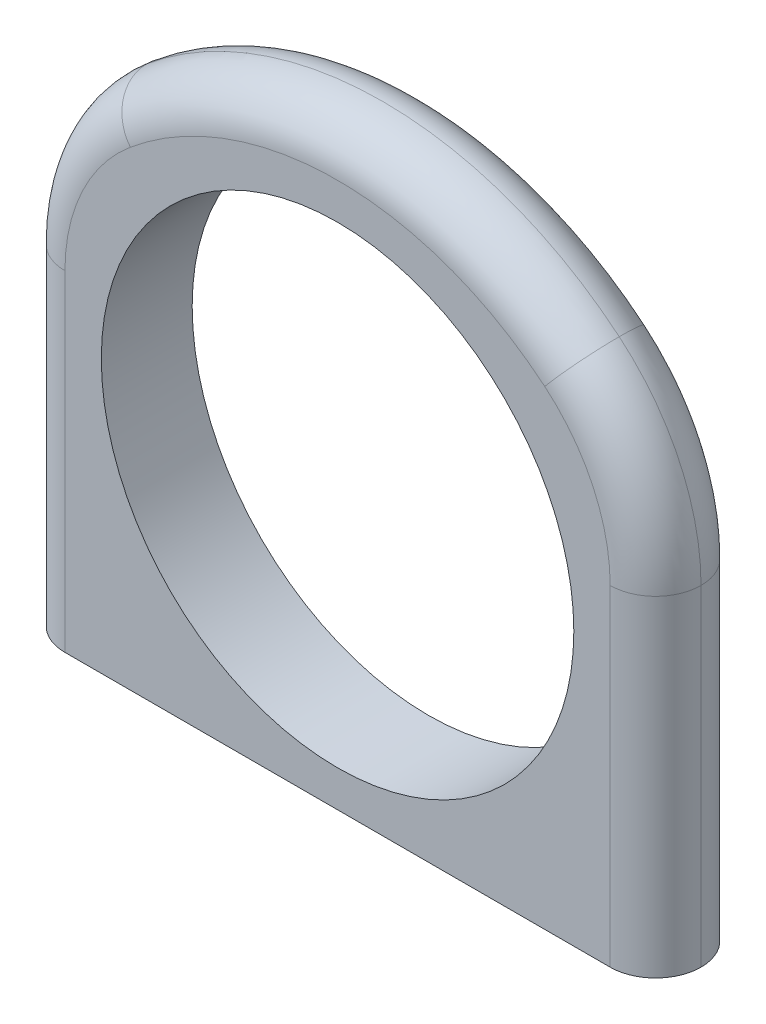
ISO-10303-21;
HEADER;
FILE_DESCRIPTION(('STEP AP214'),'2;1');
FILE_NAME('part.step','',(''),(''),'','','');
FILE_SCHEMA(('AUTOMOTIVE_DESIGN { 1 0 10303 214 1 1 1 1 }'));
ENDSEC;
DATA;
#1=APPLICATION_CONTEXT('core data for automotive mechanical design processes');
#2=APPLICATION_PROTOCOL_DEFINITION('international standard','automotive_design',2000,#1);
#3=PRODUCT_CONTEXT('',#1,'mechanical');
#4=PRODUCT('Part','Part','',(#3));
#5=PRODUCT_RELATED_PRODUCT_CATEGORY('part','',(#4));
#6=PRODUCT_DEFINITION_FORMATION('','',#4);
#7=PRODUCT_DEFINITION_CONTEXT('part definition',#1,'design');
#8=PRODUCT_DEFINITION('design','',#6,#7);
#9=PRODUCT_DEFINITION_SHAPE('','',#8);
#10=(LENGTH_UNIT() NAMED_UNIT(*) SI_UNIT(.MILLI.,.METRE.));
#11=(NAMED_UNIT(*) PLANE_ANGLE_UNIT() SI_UNIT($,.RADIAN.));
#12=(NAMED_UNIT(*) SI_UNIT($,.STERADIAN.) SOLID_ANGLE_UNIT());
#13=UNCERTAINTY_MEASURE_WITH_UNIT(LENGTH_MEASURE(1.E-05),#10,'distance_accuracy_value','');
#14=(GEOMETRIC_REPRESENTATION_CONTEXT(3) GLOBAL_UNCERTAINTY_ASSIGNED_CONTEXT((#13)) GLOBAL_UNIT_ASSIGNED_CONTEXT((#10,
#11,#12)) REPRESENTATION_CONTEXT('',''));
#15=CARTESIAN_POINT('',(0.,0.,0.));
#16=DIRECTION('',(0.,0.,1.));
#17=DIRECTION('',(1.,0.,0.));
#18=AXIS2_PLACEMENT_3D('',#15,#16,#17);
#19=CARTESIAN_POINT('',(0.,-30.,5.));
#20=DIRECTION('',(0.,1.,0.));
#21=DIRECTION('',(0.,0.,1.));
#22=AXIS2_PLACEMENT_3D('',#19,#20,#21);
#23=PLANE('',#22);
#24=CARTESIAN_POINT('',(-7.5,-30.,0.));
#25=DIRECTION('',(0.,-1.,0.));
#26=DIRECTION('',(0.,0.,-1.));
#27=AXIS2_PLACEMENT_3D('',#24,#25,#26);
#28=CIRCLE('',#27,2.);
#29=CARTESIAN_POINT('',(-7.5,-30.,-2.));
#30=VERTEX_POINT('',#29);
#31=EDGE_CURVE('E178',#30,#30,#28,.T.);
#32=ORIENTED_EDGE('',*,*,#31,.F.);
#33=EDGE_LOOP('',(#32));
#34=FACE_BOUND('',#33,.T.);
#35=CARTESIAN_POINT('',(7.5,-30.,0.));
#36=DIRECTION('',(0.,-1.,0.));
#37=DIRECTION('',(0.,0.,-1.));
#38=AXIS2_PLACEMENT_3D('',#35,#36,#37);
#39=CIRCLE('',#38,2.);
#40=CARTESIAN_POINT('',(7.5,-30.,-2.));
#41=VERTEX_POINT('',#40);
#42=EDGE_CURVE('E173',#41,#41,#39,.T.);
#43=ORIENTED_EDGE('',*,*,#42,.F.);
#44=EDGE_LOOP('',(#43));
#45=FACE_BOUND('',#44,.T.);
#46=CARTESIAN_POINT('',(-30.,-30.,0.));
#47=DIRECTION('',(0.,1.,0.));
#48=DIRECTION('',(0.,0.,1.));
#49=AXIS2_PLACEMENT_3D('',#46,#47,#48);
#50=CIRCLE('',#49,5.);
#51=CARTESIAN_POINT('',(-30.,-30.,5.));
#52=VERTEX_POINT('',#51);
#53=CARTESIAN_POINT('',(-35.,-30.,0.));
#54=VERTEX_POINT('',#53);
#55=EDGE_CURVE('E198',#52,#54,#50,.F.);
#56=ORIENTED_EDGE('',*,*,#55,.T.);
#57=CARTESIAN_POINT('',(-30.,-30.,0.));
#58=DIRECTION('',(0.,1.,0.));
#59=DIRECTION('',(0.,0.,1.));
#60=AXIS2_PLACEMENT_3D('',#57,#58,#59);
#61=CIRCLE('',#60,5.);
#62=CARTESIAN_POINT('',(-30.,-30.,-5.));
#63=VERTEX_POINT('',#62);
#64=EDGE_CURVE('E91',#54,#63,#61,.F.);
#65=ORIENTED_EDGE('',*,*,#64,.T.);
#66=DIRECTION('',(1.,0.,0.));
#67=VECTOR('',#66,1.);
#68=CARTESIAN_POINT('',(0.,-30.,-5.));
#69=LINE('',#68,#67);
#70=CARTESIAN_POINT('',(30.,-30.,-5.));
#71=VERTEX_POINT('',#70);
#72=EDGE_CURVE('E186',#63,#71,#69,.T.);
#73=ORIENTED_EDGE('',*,*,#72,.T.);
#74=CARTESIAN_POINT('',(30.,-30.,0.));
#75=DIRECTION('',(0.,1.,0.));
#76=DIRECTION('',(0.,0.,1.));
#77=AXIS2_PLACEMENT_3D('',#74,#75,#76);
#78=CIRCLE('',#77,5.);
#79=CARTESIAN_POINT('',(35.,-30.,0.));
#80=VERTEX_POINT('',#79);
#81=EDGE_CURVE('E196',#71,#80,#78,.F.);
#82=ORIENTED_EDGE('',*,*,#81,.T.);
#83=CARTESIAN_POINT('',(30.,-30.,0.));
#84=DIRECTION('',(0.,1.,0.));
#85=DIRECTION('',(0.,0.,1.));
#86=AXIS2_PLACEMENT_3D('',#83,#84,#85);
#87=CIRCLE('',#86,5.);
#88=CARTESIAN_POINT('',(30.,-30.,5.));
#89=VERTEX_POINT('',#88);
#90=EDGE_CURVE('E189',#80,#89,#87,.F.);
#91=ORIENTED_EDGE('',*,*,#90,.T.);
#92=DIRECTION('',(1.,0.,0.));
#93=VECTOR('',#92,1.);
#94=CARTESIAN_POINT('',(0.,-30.,5.));
#95=LINE('',#94,#93);
#96=EDGE_CURVE('E185',#52,#89,#95,.T.);
#97=ORIENTED_EDGE('',*,*,#96,.F.);
#98=EDGE_LOOP('',(#56,#65,#73,#82,#91,#97));
#99=FACE_BOUND('',#98,.T.);
#100=ADVANCED_FACE('F41',(#34,#45,#99),#23,.F.);
#101=CARTESIAN_POINT('',(0.,0.,5.));
#102=DIRECTION('',(0.,0.,-1.));
#103=DIRECTION('',(-1.,0.,0.));
#104=AXIS2_PLACEMENT_3D('',#101,#102,#103);
#105=CYLINDRICAL_SURFACE('',#104,26.);
#106=CARTESIAN_POINT('',(0.,0.,5.));
#107=DIRECTION('',(0.,0.,1.));
#108=DIRECTION('',(1.,0.,0.));
#109=AXIS2_PLACEMENT_3D('',#106,#107,#108);
#110=CIRCLE('',#109,26.);
#111=CARTESIAN_POINT('',(26.,0.,5.));
#112=VERTEX_POINT('',#111);
#113=EDGE_CURVE('E182',#112,#112,#110,.T.);
#114=ORIENTED_EDGE('',*,*,#113,.T.);
#115=EDGE_LOOP('',(#114));
#116=FACE_BOUND('',#115,.T.);
#117=CARTESIAN_POINT('',(0.,0.,-5.));
#118=DIRECTION('',(0.,0.,1.));
#119=DIRECTION('',(1.,0.,0.));
#120=AXIS2_PLACEMENT_3D('',#117,#118,#119);
#121=CIRCLE('',#120,26.);
#122=CARTESIAN_POINT('',(26.,0.,-5.));
#123=VERTEX_POINT('',#122);
#124=EDGE_CURVE('E190',#123,#123,#121,.T.);
#125=ORIENTED_EDGE('',*,*,#124,.F.);
#126=EDGE_LOOP('',(#125));
#127=FACE_BOUND('',#126,.T.);
#128=ADVANCED_FACE('F244',(#116,#127),#105,.F.);
#129=CARTESIAN_POINT('',(0.,0.,5.));
#130=DIRECTION('',(0.,0.,1.));
#131=DIRECTION('',(1.,0.,0.));
#132=AXIS2_PLACEMENT_3D('',#129,#130,#131);
#133=PLANE('',#132);
#134=ORIENTED_EDGE('',*,*,#113,.F.);
#135=EDGE_LOOP('',(#134));
#136=FACE_BOUND('',#135,.T.);
#137=CARTESIAN_POINT('',(-9.99999999999998,6.38085794518659,5.));
#138=DIRECTION('',(0.,0.,1.));
#139=DIRECTION('',(1.,0.,0.));
#140=AXIS2_PLACEMENT_3D('',#137,#138,#139);
#141=CIRCLE('',#140,20.);
#142=CARTESIAN_POINT('',(-22.7999999999999,21.7483561150255,5.));
#143=VERTEX_POINT('',#142);
#144=CARTESIAN_POINT('',(-30.,6.38085794518659,5.));
#145=VERTEX_POINT('',#144);
#146=EDGE_CURVE('E51',#143,#145,#141,.T.);
#147=ORIENTED_EDGE('',*,*,#146,.T.);
#148=DIRECTION('',(0.,-1.,0.));
#149=VECTOR('',#148,1.);
#150=CARTESIAN_POINT('',(-30.,-30.,5.));
#151=LINE('',#150,#149);
#152=EDGE_CURVE('E11',#145,#52,#151,.T.);
#153=ORIENTED_EDGE('',*,*,#152,.T.);
#154=ORIENTED_EDGE('',*,*,#96,.T.);
#155=DIRECTION('',(0.,-1.,0.));
#156=VECTOR('',#155,1.);
#157=CARTESIAN_POINT('',(30.,0.,5.));
#158=LINE('',#157,#156);
#159=CARTESIAN_POINT('',(30.,6.38085794518656,5.));
#160=VERTEX_POINT('',#159);
#161=EDGE_CURVE('E142',#89,#160,#158,.F.);
#162=ORIENTED_EDGE('',*,*,#161,.T.);
#163=CARTESIAN_POINT('',(10.,6.38085794518656,5.));
#164=DIRECTION('',(0.,0.,1.));
#165=DIRECTION('',(1.,0.,0.));
#166=AXIS2_PLACEMENT_3D('',#163,#164,#165);
#167=CIRCLE('',#166,20.);
#168=CARTESIAN_POINT('',(22.8,21.7483561150254,5.));
#169=VERTEX_POINT('',#168);
#170=EDGE_CURVE('E125',#160,#169,#167,.T.);
#171=ORIENTED_EDGE('',*,*,#170,.T.);
#172=CARTESIAN_POINT('',(0.,-5.62500000000005,5.));
#173=DIRECTION('',(0.,0.,1.));
#174=DIRECTION('',(1.,0.,0.));
#175=AXIS2_PLACEMENT_3D('',#172,#173,#174);
#176=CIRCLE('',#175,35.625);
#177=EDGE_CURVE('E121',#169,#143,#176,.T.);
#178=ORIENTED_EDGE('',*,*,#177,.T.);
#179=EDGE_LOOP('',(#147,#153,#154,#162,#171,#178));
#180=FACE_BOUND('',#179,.T.);
#181=ADVANCED_FACE('F123',(#136,#180),#133,.T.);
#182=CARTESIAN_POINT('',(0.,0.,-5.));
#183=DIRECTION('',(0.,0.,1.));
#184=DIRECTION('',(1.,0.,0.));
#185=AXIS2_PLACEMENT_3D('',#182,#183,#184);
#186=PLANE('',#185);
#187=ORIENTED_EDGE('',*,*,#72,.F.);
#188=DIRECTION('',(0.,-1.,0.));
#189=VECTOR('',#188,1.);
#190=CARTESIAN_POINT('',(-30.,0.,-5.));
#191=LINE('',#190,#189);
#192=CARTESIAN_POINT('',(-30.,6.38085794518659,-5.));
#193=VERTEX_POINT('',#192);
#194=EDGE_CURVE('E127',#63,#193,#191,.F.);
#195=ORIENTED_EDGE('',*,*,#194,.T.);
#196=CARTESIAN_POINT('',(-9.99999999999998,6.38085794518659,-5.));
#197=DIRECTION('',(0.,0.,1.));
#198=DIRECTION('',(1.,0.,0.));
#199=AXIS2_PLACEMENT_3D('',#196,#197,#198);
#200=CIRCLE('',#199,20.);
#201=CARTESIAN_POINT('',(-22.7999999999999,21.7483561150255,-5.));
#202=VERTEX_POINT('',#201);
#203=EDGE_CURVE('E207',#193,#202,#200,.F.);
#204=ORIENTED_EDGE('',*,*,#203,.T.);
#205=CARTESIAN_POINT('',(0.,-5.62500000000005,-5.));
#206=DIRECTION('',(0.,0.,1.));
#207=DIRECTION('',(1.,0.,0.));
#208=AXIS2_PLACEMENT_3D('',#205,#206,#207);
#209=CIRCLE('',#208,35.625);
#210=CARTESIAN_POINT('',(22.8,21.7483561150254,-5.));
#211=VERTEX_POINT('',#210);
#212=EDGE_CURVE('E201',#202,#211,#209,.F.);
#213=ORIENTED_EDGE('',*,*,#212,.T.);
#214=CARTESIAN_POINT('',(10.,6.38085794518656,-5.));
#215=DIRECTION('',(0.,0.,1.));
#216=DIRECTION('',(1.,0.,0.));
#217=AXIS2_PLACEMENT_3D('',#214,#215,#216);
#218=CIRCLE('',#217,20.);
#219=CARTESIAN_POINT('',(30.,6.38085794518656,-5.));
#220=VERTEX_POINT('',#219);
#221=EDGE_CURVE('E203',#211,#220,#218,.F.);
#222=ORIENTED_EDGE('',*,*,#221,.T.);
#223=DIRECTION('',(0.,-1.,0.));
#224=VECTOR('',#223,1.);
#225=CARTESIAN_POINT('',(30.,-30.,-5.));
#226=LINE('',#225,#224);
#227=EDGE_CURVE('E205',#220,#71,#226,.T.);
#228=ORIENTED_EDGE('',*,*,#227,.T.);
#229=EDGE_LOOP('',(#187,#195,#204,#213,#222,#228));
#230=FACE_BOUND('',#229,.T.);
#231=ORIENTED_EDGE('',*,*,#124,.T.);
#232=EDGE_LOOP('',(#231));
#233=FACE_BOUND('',#232,.T.);
#234=ADVANCED_FACE('F212',(#230,#233),#186,.F.);
#235=CARTESIAN_POINT('',(7.5,-26.,0.));
#236=DIRECTION('',(0.,-1.,0.));
#237=DIRECTION('',(0.,0.,-1.));
#238=AXIS2_PLACEMENT_3D('',#235,#236,#237);
#239=CYLINDRICAL_SURFACE('',#238,2.);
#240=CARTESIAN_POINT('',(7.5,-26.,0.));
#241=DIRECTION('',(0.,-1.,0.));
#242=DIRECTION('',(0.,0.,-1.));
#243=AXIS2_PLACEMENT_3D('',#240,#241,#242);
#244=CIRCLE('',#243,2.);
#245=CARTESIAN_POINT('',(7.5,-26.,-2.));
#246=VERTEX_POINT('',#245);
#247=EDGE_CURVE('E169',#246,#246,#244,.T.);
#248=ORIENTED_EDGE('',*,*,#247,.F.);
#249=EDGE_LOOP('',(#248));
#250=FACE_BOUND('',#249,.T.);
#251=ORIENTED_EDGE('',*,*,#42,.T.);
#252=EDGE_LOOP('',(#251));
#253=FACE_BOUND('',#252,.T.);
#254=ADVANCED_FACE('F257',(#250,#253),#239,.F.);
#255=CARTESIAN_POINT('',(7.5,-26.,0.));
#256=DIRECTION('',(0.,-1.,0.));
#257=DIRECTION('',(0.,0.,-1.));
#258=AXIS2_PLACEMENT_3D('',#255,#256,#257);
#259=PLANE('',#258);
#260=ORIENTED_EDGE('',*,*,#247,.T.);
#261=EDGE_LOOP('',(#260));
#262=FACE_BOUND('',#261,.T.);
#263=ADVANCED_FACE('F261',(#262),#259,.T.);
#264=CARTESIAN_POINT('',(-7.5,-26.,0.));
#265=DIRECTION('',(0.,-1.,0.));
#266=DIRECTION('',(0.,0.,-1.));
#267=AXIS2_PLACEMENT_3D('',#264,#265,#266);
#268=CYLINDRICAL_SURFACE('',#267,2.);
#269=CARTESIAN_POINT('',(-7.5,-26.,0.));
#270=DIRECTION('',(0.,-1.,0.));
#271=DIRECTION('',(0.,0.,-1.));
#272=AXIS2_PLACEMENT_3D('',#269,#270,#271);
#273=CIRCLE('',#272,2.);
#274=CARTESIAN_POINT('',(-7.5,-26.,-2.));
#275=VERTEX_POINT('',#274);
#276=EDGE_CURVE('E193',#275,#275,#273,.T.);
#277=ORIENTED_EDGE('',*,*,#276,.F.);
#278=EDGE_LOOP('',(#277));
#279=FACE_BOUND('',#278,.T.);
#280=ORIENTED_EDGE('',*,*,#31,.T.);
#281=EDGE_LOOP('',(#280));
#282=FACE_BOUND('',#281,.T.);
#283=ADVANCED_FACE('F264',(#279,#282),#268,.F.);
#284=CARTESIAN_POINT('',(-7.5,-26.,0.));
#285=DIRECTION('',(0.,-1.,0.));
#286=DIRECTION('',(0.,0.,-1.));
#287=AXIS2_PLACEMENT_3D('',#284,#285,#286);
#288=PLANE('',#287);
#289=ORIENTED_EDGE('',*,*,#276,.T.);
#290=EDGE_LOOP('',(#289));
#291=FACE_BOUND('',#290,.T.);
#292=ADVANCED_FACE('F270',(#291),#288,.T.);
#293=CARTESIAN_POINT('',(30.,0.,0.));
#294=DIRECTION('',(0.,-1.,0.));
#295=DIRECTION('',(1.,0.,0.));
#296=AXIS2_PLACEMENT_3D('',#293,#294,#295);
#297=CYLINDRICAL_SURFACE('',#296,5.);
#298=ORIENTED_EDGE('',*,*,#161,.F.);
#299=ORIENTED_EDGE('',*,*,#90,.F.);
#300=DIRECTION('',(0.,-1.,0.));
#301=VECTOR('',#300,1.);
#302=CARTESIAN_POINT('',(35.,0.,0.));
#303=LINE('',#302,#301);
#304=CARTESIAN_POINT('',(35.,6.38085794518656,0.));
#305=VERTEX_POINT('',#304);
#306=EDGE_CURVE('E45',#305,#80,#303,.T.);
#307=ORIENTED_EDGE('',*,*,#306,.F.);
#308=CARTESIAN_POINT('',(30.,6.38085794518656,0.));
#309=DIRECTION('',(0.,1.,0.));
#310=DIRECTION('',(-1.,0.,0.));
#311=AXIS2_PLACEMENT_3D('',#308,#309,#310);
#312=CIRCLE('',#311,5.);
#313=EDGE_CURVE('E167',#160,#305,#312,.T.);
#314=ORIENTED_EDGE('',*,*,#313,.F.);
#315=EDGE_LOOP('',(#298,#299,#307,#314));
#316=FACE_BOUND('',#315,.T.);
#317=ADVANCED_FACE('F43',(#316),#297,.T.);
#318=CARTESIAN_POINT('',(30.,0.,0.));
#319=DIRECTION('',(0.,1.,0.));
#320=DIRECTION('',(-1.,0.,0.));
#321=AXIS2_PLACEMENT_3D('',#318,#319,#320);
#322=CYLINDRICAL_SURFACE('',#321,5.);
#323=ORIENTED_EDGE('',*,*,#81,.F.);
#324=ORIENTED_EDGE('',*,*,#227,.F.);
#325=CARTESIAN_POINT('',(30.,6.38085794518656,0.));
#326=DIRECTION('',(0.,1.,0.));
#327=DIRECTION('',(-1.,0.,0.));
#328=AXIS2_PLACEMENT_3D('',#325,#326,#327);
#329=CIRCLE('',#328,5.);
#330=EDGE_CURVE('E165',#305,#220,#329,.T.);
#331=ORIENTED_EDGE('',*,*,#330,.F.);
#332=ORIENTED_EDGE('',*,*,#306,.T.);
#333=EDGE_LOOP('',(#323,#324,#331,#332));
#334=FACE_BOUND('',#333,.T.);
#335=ADVANCED_FACE('F229',(#334),#322,.T.);
#336=CARTESIAN_POINT('',(10.,6.38085794518656,0.));
#337=DIRECTION('',(0.,0.,1.));
#338=DIRECTION('',(1.,0.,0.));
#339=AXIS2_PLACEMENT_3D('',#336,#337,#338);
#340=TOROIDAL_SURFACE('',#339,20.,5.);
#341=ORIENTED_EDGE('',*,*,#170,.F.);
#342=ORIENTED_EDGE('',*,*,#313,.T.);
#343=CARTESIAN_POINT('',(10.,6.38085794518656,0.));
#344=DIRECTION('',(0.,0.,1.));
#345=DIRECTION('',(1.,0.,0.));
#346=AXIS2_PLACEMENT_3D('',#343,#344,#345);
#347=CIRCLE('',#346,25.);
#348=CARTESIAN_POINT('',(26.,25.5902306574851,0.));
#349=VERTEX_POINT('',#348);
#350=EDGE_CURVE('E76',#349,#305,#347,.F.);
#351=ORIENTED_EDGE('',*,*,#350,.F.);
#352=CARTESIAN_POINT('',(22.8,21.7483561150254,0.));
#353=DIRECTION('',(-0.768374908491942,0.64,0.));
#354=DIRECTION('',(-0.64,-0.768374908491942,0.));
#355=AXIS2_PLACEMENT_3D('',#352,#353,#354);
#356=CIRCLE('',#355,5.);
#357=EDGE_CURVE('E162',#169,#349,#356,.T.);
#358=ORIENTED_EDGE('',*,*,#357,.F.);
#359=EDGE_LOOP('',(#341,#342,#351,#358));
#360=FACE_BOUND('',#359,.T.);
#361=ADVANCED_FACE('F285',(#360),#340,.T.);
#362=CARTESIAN_POINT('',(10.,6.38085794518656,0.));
#363=DIRECTION('',(0.,0.,1.));
#364=DIRECTION('',(1.,0.,0.));
#365=AXIS2_PLACEMENT_3D('',#362,#363,#364);
#366=TOROIDAL_SURFACE('',#365,20.,5.);
#367=ORIENTED_EDGE('',*,*,#330,.T.);
#368=ORIENTED_EDGE('',*,*,#221,.F.);
#369=CARTESIAN_POINT('',(22.8,21.7483561150254,0.));
#370=DIRECTION('',(-0.768374908491942,0.64,0.));
#371=DIRECTION('',(-0.64,-0.768374908491942,0.));
#372=AXIS2_PLACEMENT_3D('',#369,#370,#371);
#373=CIRCLE('',#372,5.);
#374=EDGE_CURVE('E159',#349,#211,#373,.T.);
#375=ORIENTED_EDGE('',*,*,#374,.F.);
#376=ORIENTED_EDGE('',*,*,#350,.T.);
#377=EDGE_LOOP('',(#367,#368,#375,#376));
#378=FACE_BOUND('',#377,.T.);
#379=ADVANCED_FACE('F228',(#378),#366,.T.);
#380=CARTESIAN_POINT('',(0.,-5.62500000000005,0.));
#381=DIRECTION('',(0.,0.,1.));
#382=DIRECTION('',(1.,0.,0.));
#383=AXIS2_PLACEMENT_3D('',#380,#381,#382);
#384=TOROIDAL_SURFACE('',#383,35.625,5.);
#385=ORIENTED_EDGE('',*,*,#177,.F.);
#386=ORIENTED_EDGE('',*,*,#357,.T.);
#387=CARTESIAN_POINT('',(0.,-5.62500000000005,0.));
#388=DIRECTION('',(0.,0.,1.));
#389=DIRECTION('',(1.,0.,0.));
#390=AXIS2_PLACEMENT_3D('',#387,#388,#389);
#391=CIRCLE('',#390,40.625);
#392=CARTESIAN_POINT('',(-25.9999999999999,25.5902306574852,0.));
#393=VERTEX_POINT('',#392);
#394=EDGE_CURVE('E133',#393,#349,#391,.F.);
#395=ORIENTED_EDGE('',*,*,#394,.F.);
#396=CARTESIAN_POINT('',(-22.7999999999999,21.7483561150255,0.));
#397=DIRECTION('',(-0.768374908491944,-0.639999999999998,0.));
#398=DIRECTION('',(0.639999999999998,-0.768374908491944,0.));
#399=AXIS2_PLACEMENT_3D('',#396,#397,#398);
#400=CIRCLE('',#399,5.);
#401=EDGE_CURVE('E130',#143,#393,#400,.T.);
#402=ORIENTED_EDGE('',*,*,#401,.F.);
#403=EDGE_LOOP('',(#385,#386,#395,#402));
#404=FACE_BOUND('',#403,.T.);
#405=ADVANCED_FACE('F131',(#404),#384,.T.);
#406=CARTESIAN_POINT('',(0.,-5.62500000000005,0.));
#407=DIRECTION('',(0.,0.,1.));
#408=DIRECTION('',(1.,0.,0.));
#409=AXIS2_PLACEMENT_3D('',#406,#407,#408);
#410=TOROIDAL_SURFACE('',#409,35.625,5.);
#411=ORIENTED_EDGE('',*,*,#374,.T.);
#412=ORIENTED_EDGE('',*,*,#212,.F.);
#413=CARTESIAN_POINT('',(-22.7999999999999,21.7483561150255,0.));
#414=DIRECTION('',(-0.768374908491944,-0.639999999999998,0.));
#415=DIRECTION('',(0.639999999999998,-0.768374908491944,0.));
#416=AXIS2_PLACEMENT_3D('',#413,#414,#415);
#417=CIRCLE('',#416,5.);
#418=EDGE_CURVE('E136',#393,#202,#417,.T.);
#419=ORIENTED_EDGE('',*,*,#418,.F.);
#420=ORIENTED_EDGE('',*,*,#394,.T.);
#421=EDGE_LOOP('',(#411,#412,#419,#420));
#422=FACE_BOUND('',#421,.T.);
#423=ADVANCED_FACE('F223',(#422),#410,.T.);
#424=CARTESIAN_POINT('',(-9.99999999999998,6.38085794518659,0.));
#425=DIRECTION('',(0.,0.,1.));
#426=DIRECTION('',(1.,0.,0.));
#427=AXIS2_PLACEMENT_3D('',#424,#425,#426);
#428=TOROIDAL_SURFACE('',#427,20.,5.);
#429=ORIENTED_EDGE('',*,*,#146,.F.);
#430=ORIENTED_EDGE('',*,*,#401,.T.);
#431=CARTESIAN_POINT('',(-9.99999999999998,6.38085794518659,0.));
#432=DIRECTION('',(0.,0.,1.));
#433=DIRECTION('',(1.,0.,0.));
#434=AXIS2_PLACEMENT_3D('',#431,#432,#433);
#435=CIRCLE('',#434,25.);
#436=CARTESIAN_POINT('',(-35.,6.38085794518659,0.));
#437=VERTEX_POINT('',#436);
#438=EDGE_CURVE('E153',#437,#393,#435,.F.);
#439=ORIENTED_EDGE('',*,*,#438,.F.);
#440=CARTESIAN_POINT('',(-30.,6.38085794518659,0.));
#441=DIRECTION('',(0.,-1.,0.));
#442=DIRECTION('',(1.,0.,0.));
#443=AXIS2_PLACEMENT_3D('',#440,#441,#442);
#444=CIRCLE('',#443,5.);
#445=EDGE_CURVE('E140',#145,#437,#444,.T.);
#446=ORIENTED_EDGE('',*,*,#445,.F.);
#447=EDGE_LOOP('',(#429,#430,#439,#446));
#448=FACE_BOUND('',#447,.T.);
#449=ADVANCED_FACE('F138',(#448),#428,.T.);
#450=CARTESIAN_POINT('',(-9.99999999999998,6.38085794518659,0.));
#451=DIRECTION('',(0.,0.,1.));
#452=DIRECTION('',(1.,0.,0.));
#453=AXIS2_PLACEMENT_3D('',#450,#451,#452);
#454=TOROIDAL_SURFACE('',#453,20.,5.);
#455=ORIENTED_EDGE('',*,*,#418,.T.);
#456=ORIENTED_EDGE('',*,*,#203,.F.);
#457=CARTESIAN_POINT('',(-30.,6.38085794518659,0.));
#458=DIRECTION('',(0.,-1.,0.));
#459=DIRECTION('',(1.,0.,0.));
#460=AXIS2_PLACEMENT_3D('',#457,#458,#459);
#461=CIRCLE('',#460,5.);
#462=EDGE_CURVE('E150',#437,#193,#461,.T.);
#463=ORIENTED_EDGE('',*,*,#462,.F.);
#464=ORIENTED_EDGE('',*,*,#438,.T.);
#465=EDGE_LOOP('',(#455,#456,#463,#464));
#466=FACE_BOUND('',#465,.T.);
#467=ADVANCED_FACE('F221',(#466),#454,.T.);
#468=CARTESIAN_POINT('',(-30.,0.,0.));
#469=DIRECTION('',(0.,1.,0.));
#470=DIRECTION('',(-1.,0.,0.));
#471=AXIS2_PLACEMENT_3D('',#468,#469,#470);
#472=CYLINDRICAL_SURFACE('',#471,5.);
#473=ORIENTED_EDGE('',*,*,#152,.F.);
#474=ORIENTED_EDGE('',*,*,#445,.T.);
#475=DIRECTION('',(0.,-1.,0.));
#476=VECTOR('',#475,1.);
#477=CARTESIAN_POINT('',(-35.,6.38085794518659,0.));
#478=LINE('',#477,#476);
#479=EDGE_CURVE('E147',#54,#437,#478,.F.);
#480=ORIENTED_EDGE('',*,*,#479,.F.);
#481=ORIENTED_EDGE('',*,*,#55,.F.);
#482=EDGE_LOOP('',(#473,#474,#480,#481));
#483=FACE_BOUND('',#482,.T.);
#484=ADVANCED_FACE('F234',(#483),#472,.T.);
#485=CARTESIAN_POINT('',(-30.,0.,0.));
#486=DIRECTION('',(0.,-1.,0.));
#487=DIRECTION('',(1.,0.,0.));
#488=AXIS2_PLACEMENT_3D('',#485,#486,#487);
#489=CYLINDRICAL_SURFACE('',#488,5.);
#490=ORIENTED_EDGE('',*,*,#462,.T.);
#491=ORIENTED_EDGE('',*,*,#194,.F.);
#492=ORIENTED_EDGE('',*,*,#64,.F.);
#493=ORIENTED_EDGE('',*,*,#479,.T.);
#494=EDGE_LOOP('',(#490,#491,#492,#493));
#495=FACE_BOUND('',#494,.T.);
#496=ADVANCED_FACE('F217',(#495),#489,.T.);
#497=CLOSED_SHELL('',(#100,#128,#181,#234,#254,#263,#283,#292,#317,#335,#361,#379,#405,#423,
#449,#467,#484,#496));
#498=MANIFOLD_SOLID_BREP('B2',#497);
#499=ADVANCED_BREP_SHAPE_REPRESENTATION('',(#18,#498),#14);
#500=SHAPE_DEFINITION_REPRESENTATION(#9,#499);
ENDSEC;
END-ISO-10303-21;
